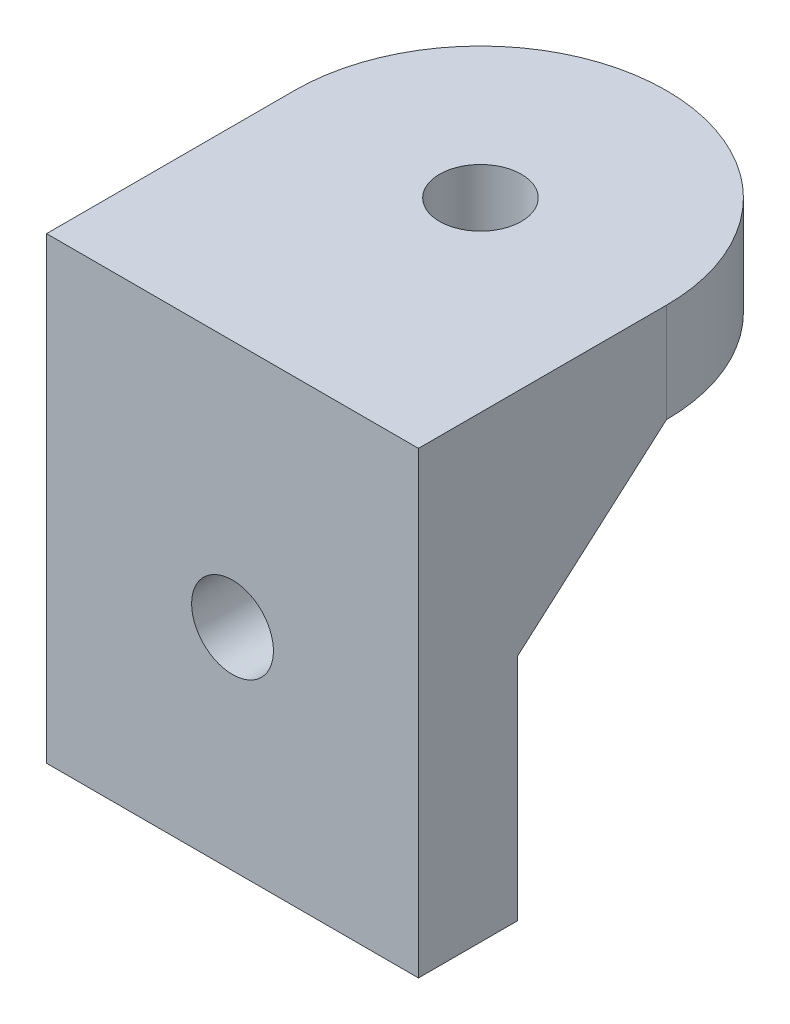
ISO-10303-21;
HEADER;
FILE_DESCRIPTION(('STEP AP214'),'2;1');
FILE_NAME('part.step','',(''),(''),'','','');
FILE_SCHEMA(('AUTOMOTIVE_DESIGN { 1 0 10303 214 1 1 1 1 }'));
ENDSEC;
DATA;
#1=APPLICATION_CONTEXT('core data for automotive mechanical design processes');
#2=APPLICATION_PROTOCOL_DEFINITION('international standard','automotive_design',2000,#1);
#3=PRODUCT_CONTEXT('',#1,'mechanical');
#4=PRODUCT('Part','Part','',(#3));
#5=PRODUCT_RELATED_PRODUCT_CATEGORY('part','',(#4));
#6=PRODUCT_DEFINITION_FORMATION('','',#4);
#7=PRODUCT_DEFINITION_CONTEXT('part definition',#1,'design');
#8=PRODUCT_DEFINITION('design','',#6,#7);
#9=PRODUCT_DEFINITION_SHAPE('','',#8);
#10=(LENGTH_UNIT() NAMED_UNIT(*) SI_UNIT(.MILLI.,.METRE.));
#11=(NAMED_UNIT(*) PLANE_ANGLE_UNIT() SI_UNIT($,.RADIAN.));
#12=(NAMED_UNIT(*) SI_UNIT($,.STERADIAN.) SOLID_ANGLE_UNIT());
#13=UNCERTAINTY_MEASURE_WITH_UNIT(LENGTH_MEASURE(1.E-05),#10,'distance_accuracy_value','');
#14=(GEOMETRIC_REPRESENTATION_CONTEXT(3) GLOBAL_UNCERTAINTY_ASSIGNED_CONTEXT((#13)) GLOBAL_UNIT_ASSIGNED_CONTEXT((#10,
#11,#12)) REPRESENTATION_CONTEXT('',''));
#15=CARTESIAN_POINT('',(0.,0.,0.));
#16=DIRECTION('',(0.,0.,1.));
#17=DIRECTION('',(1.,0.,0.));
#18=AXIS2_PLACEMENT_3D('',#15,#16,#17);
#19=CARTESIAN_POINT('',(15.,18.5,0.));
#20=DIRECTION('',(0.,0.,-1.));
#21=DIRECTION('',(-1.,0.,0.));
#22=AXIS2_PLACEMENT_3D('',#19,#20,#21);
#23=PLANE('',#22);
#24=CARTESIAN_POINT('',(0.,-1.5,0.));
#25=DIRECTION('',(0.,0.,-1.));
#26=DIRECTION('',(-1.,0.,0.));
#27=AXIS2_PLACEMENT_3D('',#24,#25,#26);
#28=CIRCLE('',#27,6.3);
#29=CARTESIAN_POINT('',(-6.3,-1.5,0.));
#30=VERTEX_POINT('',#29);
#31=EDGE_CURVE('E173',#30,#30,#28,.T.);
#32=ORIENTED_EDGE('',*,*,#31,.F.);
#33=EDGE_LOOP('',(#32));
#34=FACE_BOUND('',#33,.T.);
#35=DIRECTION('',(0.,-1.,0.));
#36=VECTOR('',#35,1.);
#37=CARTESIAN_POINT('',(-15.,-18.5,0.));
#38=LINE('',#37,#36);
#39=CARTESIAN_POINT('',(-15.,0.,0.));
#40=VERTEX_POINT('',#39);
#41=CARTESIAN_POINT('',(-15.,-18.5,0.));
#42=VERTEX_POINT('',#41);
#43=EDGE_CURVE('E64',#40,#42,#38,.T.);
#44=ORIENTED_EDGE('',*,*,#43,.F.);
#45=DIRECTION('',(-1.,0.,0.));
#46=VECTOR('',#45,1.);
#47=CARTESIAN_POINT('',(-11.2,0.,0.));
#48=LINE('',#47,#46);
#49=CARTESIAN_POINT('',(-11.2,0.,0.));
#50=VERTEX_POINT('',#49);
#51=EDGE_CURVE('E150',#50,#40,#48,.T.);
#52=ORIENTED_EDGE('',*,*,#51,.F.);
#53=DIRECTION('',(0.,-1.,0.));
#54=VECTOR('',#53,1.);
#55=CARTESIAN_POINT('',(-11.2,10.5,0.));
#56=LINE('',#55,#54);
#57=CARTESIAN_POINT('',(-11.2,10.5,0.));
#58=VERTEX_POINT('',#57);
#59=EDGE_CURVE('E163',#58,#50,#56,.T.);
#60=ORIENTED_EDGE('',*,*,#59,.F.);
#61=DIRECTION('',(-1.,0.,0.));
#62=VECTOR('',#61,1.);
#63=CARTESIAN_POINT('',(15.,10.5,0.));
#64=LINE('',#63,#62);
#65=CARTESIAN_POINT('',(11.2,10.5,0.));
#66=VERTEX_POINT('',#65);
#67=EDGE_CURVE('E11',#66,#58,#64,.T.);
#68=ORIENTED_EDGE('',*,*,#67,.F.);
#69=DIRECTION('',(0.,-1.,0.));
#70=VECTOR('',#69,1.);
#71=CARTESIAN_POINT('',(11.2,10.5,0.));
#72=LINE('',#71,#70);
#73=CARTESIAN_POINT('',(11.2,0.,0.));
#74=VERTEX_POINT('',#73);
#75=EDGE_CURVE('E138',#66,#74,#72,.T.);
#76=ORIENTED_EDGE('',*,*,#75,.T.);
#77=DIRECTION('',(1.,0.,0.));
#78=VECTOR('',#77,1.);
#79=CARTESIAN_POINT('',(11.2,0.,0.));
#80=LINE('',#79,#78);
#81=CARTESIAN_POINT('',(15.,0.,0.));
#82=VERTEX_POINT('',#81);
#83=EDGE_CURVE('E130',#74,#82,#80,.T.);
#84=ORIENTED_EDGE('',*,*,#83,.T.);
#85=DIRECTION('',(0.,1.,0.));
#86=VECTOR('',#85,1.);
#87=CARTESIAN_POINT('',(15.,-18.5,0.));
#88=LINE('',#87,#86);
#89=CARTESIAN_POINT('',(15.,-18.5,0.));
#90=VERTEX_POINT('',#89);
#91=EDGE_CURVE('E114',#90,#82,#88,.T.);
#92=ORIENTED_EDGE('',*,*,#91,.F.);
#93=DIRECTION('',(1.,0.,0.));
#94=VECTOR('',#93,1.);
#95=CARTESIAN_POINT('',(-15.,-18.5,0.));
#96=LINE('',#95,#94);
#97=EDGE_CURVE('E118',#42,#90,#96,.T.);
#98=ORIENTED_EDGE('',*,*,#97,.F.);
#99=EDGE_LOOP('',(#44,#52,#60,#68,#76,#84,#92,#98));
#100=FACE_BOUND('',#99,.T.);
#101=ADVANCED_FACE('F35',(#34,#100),#23,.T.);
#102=CARTESIAN_POINT('',(0.,10.5,-12.));
#103=DIRECTION('',(0.,-1.,0.));
#104=DIRECTION('',(0.,0.,-1.));
#105=AXIS2_PLACEMENT_3D('',#102,#103,#104);
#106=PLANE('',#105);
#107=CARTESIAN_POINT('',(0.,10.5,-12.));
#108=DIRECTION('',(0.,-1.,0.));
#109=DIRECTION('',(0.,0.,-1.));
#110=AXIS2_PLACEMENT_3D('',#107,#108,#109);
#111=CIRCLE('',#110,6.3);
#112=CARTESIAN_POINT('',(0.,10.5,-18.3));
#113=VERTEX_POINT('',#112);
#114=EDGE_CURVE('E182',#113,#113,#111,.T.);
#115=ORIENTED_EDGE('',*,*,#114,.F.);
#116=EDGE_LOOP('',(#115));
#117=FACE_BOUND('',#116,.T.);
#118=DIRECTION('',(0.,0.,1.));
#119=VECTOR('',#118,1.);
#120=CARTESIAN_POINT('',(-11.2,10.5,-12.));
#121=LINE('',#120,#119);
#122=CARTESIAN_POINT('',(-11.2,10.5,-12.));
#123=VERTEX_POINT('',#122);
#124=EDGE_CURVE('E153',#123,#58,#121,.T.);
#125=ORIENTED_EDGE('',*,*,#124,.F.);
#126=DIRECTION('',(-1.,0.,0.));
#127=VECTOR('',#126,1.);
#128=CARTESIAN_POINT('',(-11.2,10.5,-12.));
#129=LINE('',#128,#127);
#130=CARTESIAN_POINT('',(-15.,10.5,-12.));
#131=VERTEX_POINT('',#130);
#132=EDGE_CURVE('E142',#123,#131,#129,.T.);
#133=ORIENTED_EDGE('',*,*,#132,.T.);
#134=CARTESIAN_POINT('',(0.,10.5,-12.));
#135=DIRECTION('',(0.,1.,0.));
#136=DIRECTION('',(0.,0.,-1.));
#137=AXIS2_PLACEMENT_3D('',#134,#135,#136);
#138=CIRCLE('',#137,15.);
#139=CARTESIAN_POINT('',(15.,10.5,-12.));
#140=VERTEX_POINT('',#139);
#141=EDGE_CURVE('E127',#140,#131,#138,.T.);
#142=ORIENTED_EDGE('',*,*,#141,.F.);
#143=DIRECTION('',(1.,0.,0.));
#144=VECTOR('',#143,1.);
#145=CARTESIAN_POINT('',(11.2,10.5,-12.));
#146=LINE('',#145,#144);
#147=CARTESIAN_POINT('',(11.2,10.5,-12.));
#148=VERTEX_POINT('',#147);
#149=EDGE_CURVE('E134',#148,#140,#146,.T.);
#150=ORIENTED_EDGE('',*,*,#149,.F.);
#151=DIRECTION('',(0.,0.,1.));
#152=VECTOR('',#151,1.);
#153=CARTESIAN_POINT('',(11.2,10.5,-12.));
#154=LINE('',#153,#152);
#155=EDGE_CURVE('E145',#148,#66,#154,.T.);
#156=ORIENTED_EDGE('',*,*,#155,.T.);
#157=ORIENTED_EDGE('',*,*,#67,.T.);
#158=EDGE_LOOP('',(#125,#133,#142,#150,#156,#157));
#159=FACE_BOUND('',#158,.T.);
#160=ADVANCED_FACE('F188',(#117,#159),#106,.T.);
#161=CARTESIAN_POINT('',(15.,-18.5,8.));
#162=DIRECTION('',(-1.,0.,0.));
#163=DIRECTION('',(0.,0.,1.));
#164=AXIS2_PLACEMENT_3D('',#161,#162,#163);
#165=PLANE('',#164);
#166=ORIENTED_EDGE('',*,*,#91,.T.);
#167=DIRECTION('',(0.,0.658504607868518,-0.752576694706878));
#168=VECTOR('',#167,1.);
#169=CARTESIAN_POINT('',(15.,0.,0.));
#170=LINE('',#169,#168);
#171=EDGE_CURVE('E75',#82,#140,#170,.T.);
#172=ORIENTED_EDGE('',*,*,#171,.T.);
#173=DIRECTION('',(0.,1.,0.));
#174=VECTOR('',#173,1.);
#175=CARTESIAN_POINT('',(15.,10.5,-12.));
#176=LINE('',#175,#174);
#177=CARTESIAN_POINT('',(15.,18.5,-12.));
#178=VERTEX_POINT('',#177);
#179=EDGE_CURVE('E123',#140,#178,#176,.T.);
#180=ORIENTED_EDGE('',*,*,#179,.T.);
#181=DIRECTION('',(0.,0.,-1.));
#182=VECTOR('',#181,1.);
#183=CARTESIAN_POINT('',(15.,18.5,8.));
#184=LINE('',#183,#182);
#185=CARTESIAN_POINT('',(15.,18.5,8.));
#186=VERTEX_POINT('',#185);
#187=EDGE_CURVE('E44',#186,#178,#184,.T.);
#188=ORIENTED_EDGE('',*,*,#187,.F.);
#189=DIRECTION('',(0.,1.,0.));
#190=VECTOR('',#189,1.);
#191=CARTESIAN_POINT('',(15.,-18.5,8.));
#192=LINE('',#191,#190);
#193=CARTESIAN_POINT('',(15.,-18.5,8.));
#194=VERTEX_POINT('',#193);
#195=EDGE_CURVE('E95',#194,#186,#192,.T.);
#196=ORIENTED_EDGE('',*,*,#195,.F.);
#197=DIRECTION('',(0.,0.,-1.));
#198=VECTOR('',#197,1.);
#199=CARTESIAN_POINT('',(15.,-18.5,8.));
#200=LINE('',#199,#198);
#201=EDGE_CURVE('E110',#194,#90,#200,.T.);
#202=ORIENTED_EDGE('',*,*,#201,.T.);
#203=EDGE_LOOP('',(#166,#172,#180,#188,#196,#202));
#204=FACE_BOUND('',#203,.T.);
#205=ADVANCED_FACE('F37',(#204),#165,.F.);
#206=CARTESIAN_POINT('',(-15.,18.5,8.));
#207=DIRECTION('',(0.,-1.,0.));
#208=DIRECTION('',(0.,0.,-1.));
#209=AXIS2_PLACEMENT_3D('',#206,#207,#208);
#210=PLANE('',#209);
#211=CARTESIAN_POINT('',(0.,18.5,-12.));
#212=DIRECTION('',(0.,-1.,0.));
#213=DIRECTION('',(0.,0.,-1.));
#214=AXIS2_PLACEMENT_3D('',#211,#212,#213);
#215=CIRCLE('',#214,3.3);
#216=CARTESIAN_POINT('',(0.,18.5,-15.3));
#217=VERTEX_POINT('',#216);
#218=EDGE_CURVE('E176',#217,#217,#215,.T.);
#219=ORIENTED_EDGE('',*,*,#218,.T.);
#220=EDGE_LOOP('',(#219));
#221=FACE_BOUND('',#220,.T.);
#222=ORIENTED_EDGE('',*,*,#187,.T.);
#223=CARTESIAN_POINT('',(0.,18.5,-12.));
#224=DIRECTION('',(0.,1.,0.));
#225=DIRECTION('',(0.,0.,-1.));
#226=AXIS2_PLACEMENT_3D('',#223,#224,#225);
#227=CIRCLE('',#226,15.);
#228=CARTESIAN_POINT('',(-15.,18.5,-12.));
#229=VERTEX_POINT('',#228);
#230=EDGE_CURVE('E103',#178,#229,#227,.T.);
#231=ORIENTED_EDGE('',*,*,#230,.T.);
#232=DIRECTION('',(0.,0.,-1.));
#233=VECTOR('',#232,1.);
#234=CARTESIAN_POINT('',(-15.,18.5,8.));
#235=LINE('',#234,#233);
#236=CARTESIAN_POINT('',(-15.,18.5,8.));
#237=VERTEX_POINT('',#236);
#238=EDGE_CURVE('E100',#237,#229,#235,.T.);
#239=ORIENTED_EDGE('',*,*,#238,.F.);
#240=DIRECTION('',(-1.,0.,0.));
#241=VECTOR('',#240,1.);
#242=CARTESIAN_POINT('',(-15.,18.5,8.));
#243=LINE('',#242,#241);
#244=EDGE_CURVE('E89',#186,#237,#243,.T.);
#245=ORIENTED_EDGE('',*,*,#244,.F.);
#246=EDGE_LOOP('',(#222,#231,#239,#245));
#247=FACE_BOUND('',#246,.T.);
#248=ADVANCED_FACE('F101',(#221,#247),#210,.F.);
#249=CARTESIAN_POINT('',(-15.,-18.5,8.));
#250=DIRECTION('',(1.,0.,0.));
#251=DIRECTION('',(0.,0.,-1.));
#252=AXIS2_PLACEMENT_3D('',#249,#250,#251);
#253=PLANE('',#252);
#254=DIRECTION('',(0.,0.658504607868518,-0.752576694706878));
#255=VECTOR('',#254,1.);
#256=CARTESIAN_POINT('',(-15.,0.,0.));
#257=LINE('',#256,#255);
#258=EDGE_CURVE('E156',#40,#131,#257,.T.);
#259=ORIENTED_EDGE('',*,*,#258,.F.);
#260=ORIENTED_EDGE('',*,*,#43,.T.);
#261=DIRECTION('',(0.,0.,-1.));
#262=VECTOR('',#261,1.);
#263=CARTESIAN_POINT('',(-15.,-18.5,8.));
#264=LINE('',#263,#262);
#265=CARTESIAN_POINT('',(-15.,-18.5,8.));
#266=VERTEX_POINT('',#265);
#267=EDGE_CURVE('E106',#266,#42,#264,.T.);
#268=ORIENTED_EDGE('',*,*,#267,.F.);
#269=DIRECTION('',(0.,-1.,0.));
#270=VECTOR('',#269,1.);
#271=CARTESIAN_POINT('',(-15.,-18.5,8.));
#272=LINE('',#271,#270);
#273=EDGE_CURVE('E93',#237,#266,#272,.T.);
#274=ORIENTED_EDGE('',*,*,#273,.F.);
#275=ORIENTED_EDGE('',*,*,#238,.T.);
#276=DIRECTION('',(0.,1.,0.));
#277=VECTOR('',#276,1.);
#278=CARTESIAN_POINT('',(-15.,10.5,-12.));
#279=LINE('',#278,#277);
#280=EDGE_CURVE('E116',#131,#229,#279,.T.);
#281=ORIENTED_EDGE('',*,*,#280,.F.);
#282=EDGE_LOOP('',(#259,#260,#268,#274,#275,#281));
#283=FACE_BOUND('',#282,.T.);
#284=ADVANCED_FACE('F108',(#283),#253,.F.);
#285=CARTESIAN_POINT('',(-15.,-18.5,8.));
#286=DIRECTION('',(0.,1.,0.));
#287=DIRECTION('',(0.,0.,1.));
#288=AXIS2_PLACEMENT_3D('',#285,#286,#287);
#289=PLANE('',#288);
#290=ORIENTED_EDGE('',*,*,#97,.T.);
#291=ORIENTED_EDGE('',*,*,#201,.F.);
#292=DIRECTION('',(1.,0.,0.));
#293=VECTOR('',#292,1.);
#294=CARTESIAN_POINT('',(-15.,-18.5,8.));
#295=LINE('',#294,#293);
#296=EDGE_CURVE('E52',#266,#194,#295,.T.);
#297=ORIENTED_EDGE('',*,*,#296,.F.);
#298=ORIENTED_EDGE('',*,*,#267,.T.);
#299=EDGE_LOOP('',(#290,#291,#297,#298));
#300=FACE_BOUND('',#299,.T.);
#301=ADVANCED_FACE('F228',(#300),#289,.F.);
#302=CARTESIAN_POINT('',(15.,18.5,8.));
#303=DIRECTION('',(0.,0.,-1.));
#304=DIRECTION('',(-1.,0.,0.));
#305=AXIS2_PLACEMENT_3D('',#302,#303,#304);
#306=PLANE('',#305);
#307=CARTESIAN_POINT('',(0.,-1.5,8.));
#308=DIRECTION('',(0.,0.,-1.));
#309=DIRECTION('',(-1.,0.,0.));
#310=AXIS2_PLACEMENT_3D('',#307,#308,#309);
#311=CIRCLE('',#310,3.3);
#312=CARTESIAN_POINT('',(-3.3,-1.5,8.));
#313=VERTEX_POINT('',#312);
#314=EDGE_CURVE('E160',#313,#313,#311,.T.);
#315=ORIENTED_EDGE('',*,*,#314,.T.);
#316=EDGE_LOOP('',(#315));
#317=FACE_BOUND('',#316,.T.);
#318=ORIENTED_EDGE('',*,*,#195,.T.);
#319=ORIENTED_EDGE('',*,*,#244,.T.);
#320=ORIENTED_EDGE('',*,*,#273,.T.);
#321=ORIENTED_EDGE('',*,*,#296,.T.);
#322=EDGE_LOOP('',(#318,#319,#320,#321));
#323=FACE_BOUND('',#322,.T.);
#324=ADVANCED_FACE('F91',(#317,#323),#306,.F.);
#325=CARTESIAN_POINT('',(0.,10.5,-12.));
#326=DIRECTION('',(0.,1.,0.));
#327=DIRECTION('',(0.,0.,1.));
#328=AXIS2_PLACEMENT_3D('',#325,#326,#327);
#329=CYLINDRICAL_SURFACE('',#328,15.);
#330=ORIENTED_EDGE('',*,*,#230,.F.);
#331=ORIENTED_EDGE('',*,*,#179,.F.);
#332=ORIENTED_EDGE('',*,*,#141,.T.);
#333=ORIENTED_EDGE('',*,*,#280,.T.);
#334=EDGE_LOOP('',(#330,#331,#332,#333));
#335=FACE_BOUND('',#334,.T.);
#336=ADVANCED_FACE('F129',(#335),#329,.T.);
#337=CARTESIAN_POINT('',(11.2,0.,0.));
#338=DIRECTION('',(0.,-0.752576694706878,-0.658504607868518));
#339=DIRECTION('',(0.,0.658504607868518,-0.752576694706878));
#340=AXIS2_PLACEMENT_3D('',#337,#338,#339);
#341=PLANE('',#340);
#342=ORIENTED_EDGE('',*,*,#171,.F.);
#343=ORIENTED_EDGE('',*,*,#83,.F.);
#344=DIRECTION('',(0.,0.658504607868518,-0.752576694706878));
#345=VECTOR('',#344,1.);
#346=CARTESIAN_POINT('',(11.2,0.,0.));
#347=LINE('',#346,#345);
#348=EDGE_CURVE('E141',#74,#148,#347,.T.);
#349=ORIENTED_EDGE('',*,*,#348,.T.);
#350=ORIENTED_EDGE('',*,*,#149,.T.);
#351=EDGE_LOOP('',(#342,#343,#349,#350));
#352=FACE_BOUND('',#351,.T.);
#353=ADVANCED_FACE('F220',(#352),#341,.T.);
#354=CARTESIAN_POINT('',(11.2,0.,0.));
#355=DIRECTION('',(-1.,0.,0.));
#356=DIRECTION('',(0.,0.,1.));
#357=AXIS2_PLACEMENT_3D('',#354,#355,#356);
#358=PLANE('',#357);
#359=ORIENTED_EDGE('',*,*,#348,.F.);
#360=ORIENTED_EDGE('',*,*,#75,.F.);
#361=ORIENTED_EDGE('',*,*,#155,.F.);
#362=EDGE_LOOP('',(#359,#360,#361));
#363=FACE_BOUND('',#362,.T.);
#364=ADVANCED_FACE('F225',(#363),#358,.T.);
#365=CARTESIAN_POINT('',(-11.2,0.,0.));
#366=DIRECTION('',(0.,0.752576694706878,0.658504607868518));
#367=DIRECTION('',(0.,-0.658504607868518,0.752576694706878));
#368=AXIS2_PLACEMENT_3D('',#365,#366,#367);
#369=PLANE('',#368);
#370=ORIENTED_EDGE('',*,*,#258,.T.);
#371=ORIENTED_EDGE('',*,*,#132,.F.);
#372=DIRECTION('',(0.,0.658504607868518,-0.752576694706878));
#373=VECTOR('',#372,1.);
#374=CARTESIAN_POINT('',(-11.2,0.,0.));
#375=LINE('',#374,#373);
#376=EDGE_CURVE('E159',#50,#123,#375,.T.);
#377=ORIENTED_EDGE('',*,*,#376,.F.);
#378=ORIENTED_EDGE('',*,*,#51,.T.);
#379=EDGE_LOOP('',(#370,#371,#377,#378));
#380=FACE_BOUND('',#379,.T.);
#381=ADVANCED_FACE('F212',(#380),#369,.F.);
#382=CARTESIAN_POINT('',(-11.2,0.,0.));
#383=DIRECTION('',(1.,0.,0.));
#384=DIRECTION('',(0.,0.,1.));
#385=AXIS2_PLACEMENT_3D('',#382,#383,#384);
#386=PLANE('',#385);
#387=ORIENTED_EDGE('',*,*,#376,.T.);
#388=ORIENTED_EDGE('',*,*,#124,.T.);
#389=ORIENTED_EDGE('',*,*,#59,.T.);
#390=EDGE_LOOP('',(#387,#388,#389));
#391=FACE_BOUND('',#390,.T.);
#392=ADVANCED_FACE('F201',(#391),#386,.T.);
#393=CARTESIAN_POINT('',(0.,-1.5,0.));
#394=DIRECTION('',(0.,0.,-1.));
#395=DIRECTION('',(-1.,0.,0.));
#396=AXIS2_PLACEMENT_3D('',#393,#394,#395);
#397=CYLINDRICAL_SURFACE('',#396,3.3);
#398=ORIENTED_EDGE('',*,*,#314,.F.);
#399=EDGE_LOOP('',(#398));
#400=FACE_BOUND('',#399,.T.);
#401=CARTESIAN_POINT('',(0.,-1.5,3.));
#402=DIRECTION('',(0.,0.,-1.));
#403=DIRECTION('',(-1.,0.,0.));
#404=AXIS2_PLACEMENT_3D('',#401,#402,#403);
#405=CIRCLE('',#404,3.3);
#406=CARTESIAN_POINT('',(-3.3,-1.5,3.));
#407=VERTEX_POINT('',#406);
#408=EDGE_CURVE('E170',#407,#407,#405,.T.);
#409=ORIENTED_EDGE('',*,*,#408,.T.);
#410=EDGE_LOOP('',(#409));
#411=FACE_BOUND('',#410,.T.);
#412=ADVANCED_FACE('F255',(#400,#411),#397,.F.);
#413=CARTESIAN_POINT('',(0.,-1.5,0.));
#414=DIRECTION('',(0.,0.,-1.));
#415=DIRECTION('',(-1.,0.,0.));
#416=AXIS2_PLACEMENT_3D('',#413,#414,#415);
#417=CONICAL_SURFACE('',#416,6.3,0.785398163397449);
#418=ORIENTED_EDGE('',*,*,#408,.F.);
#419=EDGE_LOOP('',(#418));
#420=FACE_BOUND('',#419,.T.);
#421=ORIENTED_EDGE('',*,*,#31,.T.);
#422=EDGE_LOOP('',(#421));
#423=FACE_BOUND('',#422,.T.);
#424=ADVANCED_FACE('F258',(#420,#423),#417,.F.);
#425=CARTESIAN_POINT('',(0.,10.5,-12.));
#426=DIRECTION('',(0.,-1.,0.));
#427=DIRECTION('',(0.,0.,-1.));
#428=AXIS2_PLACEMENT_3D('',#425,#426,#427);
#429=CYLINDRICAL_SURFACE('',#428,3.3);
#430=ORIENTED_EDGE('',*,*,#218,.F.);
#431=EDGE_LOOP('',(#430));
#432=FACE_BOUND('',#431,.T.);
#433=CARTESIAN_POINT('',(0.,13.5,-12.));
#434=DIRECTION('',(0.,-1.,0.));
#435=DIRECTION('',(0.,0.,-1.));
#436=AXIS2_PLACEMENT_3D('',#433,#434,#435);
#437=CIRCLE('',#436,3.3);
#438=CARTESIAN_POINT('',(0.,13.5,-15.3));
#439=VERTEX_POINT('',#438);
#440=EDGE_CURVE('E179',#439,#439,#437,.T.);
#441=ORIENTED_EDGE('',*,*,#440,.T.);
#442=EDGE_LOOP('',(#441));
#443=FACE_BOUND('',#442,.T.);
#444=ADVANCED_FACE('F262',(#432,#443),#429,.F.);
#445=CARTESIAN_POINT('',(0.,10.5,-12.));
#446=DIRECTION('',(0.,-1.,0.));
#447=DIRECTION('',(0.,0.,-1.));
#448=AXIS2_PLACEMENT_3D('',#445,#446,#447);
#449=CONICAL_SURFACE('',#448,6.3,0.785398163397449);
#450=ORIENTED_EDGE('',*,*,#440,.F.);
#451=EDGE_LOOP('',(#450));
#452=FACE_BOUND('',#451,.T.);
#453=ORIENTED_EDGE('',*,*,#114,.T.);
#454=EDGE_LOOP('',(#453));
#455=FACE_BOUND('',#454,.T.);
#456=ADVANCED_FACE('F186',(#452,#455),#449,.F.);
#457=CLOSED_SHELL('',(#101,#160,#205,#248,#284,#301,#324,#336,#353,#364,#381,#392,#412,#424,
#444,#456));
#458=MANIFOLD_SOLID_BREP('B2',#457);
#459=ADVANCED_BREP_SHAPE_REPRESENTATION('',(#18,#458),#14);
#460=SHAPE_DEFINITION_REPRESENTATION(#9,#459);
ENDSEC;
END-ISO-10303-21;
